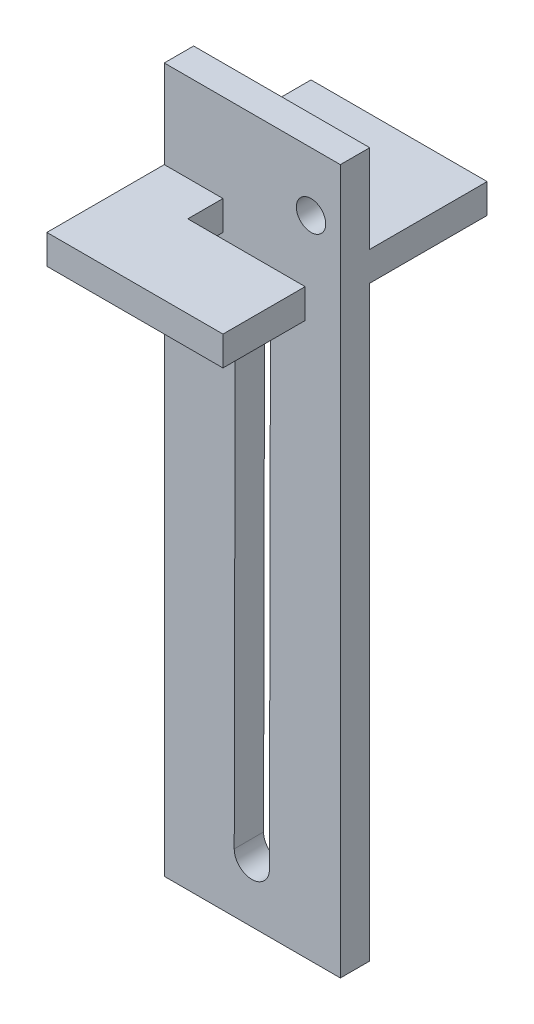
ISO-10303-21;
HEADER;
FILE_DESCRIPTION(('STEP AP214'),'2;1');
FILE_NAME('part.step','',(''),(''),'','','');
FILE_SCHEMA(('AUTOMOTIVE_DESIGN { 1 0 10303 214 1 1 1 1 }'));
ENDSEC;
DATA;
#1=APPLICATION_CONTEXT('core data for automotive mechanical design processes');
#2=APPLICATION_PROTOCOL_DEFINITION('international standard','automotive_design',2000,#1);
#3=PRODUCT_CONTEXT('',#1,'mechanical');
#4=PRODUCT('Part','Part','',(#3));
#5=PRODUCT_RELATED_PRODUCT_CATEGORY('part','',(#4));
#6=PRODUCT_DEFINITION_FORMATION('','',#4);
#7=PRODUCT_DEFINITION_CONTEXT('part definition',#1,'design');
#8=PRODUCT_DEFINITION('design','',#6,#7);
#9=PRODUCT_DEFINITION_SHAPE('','',#8);
#10=(LENGTH_UNIT() NAMED_UNIT(*) SI_UNIT(.MILLI.,.METRE.));
#11=(NAMED_UNIT(*) PLANE_ANGLE_UNIT() SI_UNIT($,.RADIAN.));
#12=(NAMED_UNIT(*) SI_UNIT($,.STERADIAN.) SOLID_ANGLE_UNIT());
#13=UNCERTAINTY_MEASURE_WITH_UNIT(LENGTH_MEASURE(1.E-05),#10,'distance_accuracy_value','');
#14=(GEOMETRIC_REPRESENTATION_CONTEXT(3) GLOBAL_UNCERTAINTY_ASSIGNED_CONTEXT((#13)) GLOBAL_UNIT_ASSIGNED_CONTEXT((#10,
#11,#12)) REPRESENTATION_CONTEXT('',''));
#15=CARTESIAN_POINT('',(0.,0.,0.));
#16=DIRECTION('',(0.,0.,1.));
#17=DIRECTION('',(1.,0.,0.));
#18=AXIS2_PLACEMENT_3D('',#15,#16,#17);
#19=CARTESIAN_POINT('',(26.5320893378885,41.3530947794546,5.));
#20=DIRECTION('',(-1.,0.,0.));
#21=DIRECTION('',(0.,-1.,0.));
#22=AXIS2_PLACEMENT_3D('',#19,#20,#21);
#23=PLANE('',#22);
#24=DIRECTION('',(0.,0.,-1.));
#25=VECTOR('',#24,1.);
#26=CARTESIAN_POINT('',(26.5320893378885,41.3530947794546,-20.));
#27=LINE('',#26,#25);
#28=CARTESIAN_POINT('',(26.5320893378885,41.3530947794546,25.));
#29=VERTEX_POINT('',#28);
#30=CARTESIAN_POINT('',(26.5320893378885,41.3530947794546,11.));
#31=VERTEX_POINT('',#30);
#32=EDGE_CURVE('E233',#29,#31,#27,.T.);
#33=ORIENTED_EDGE('',*,*,#32,.T.);
#34=DIRECTION('',(0.,-1.,0.));
#35=VECTOR('',#34,1.);
#36=CARTESIAN_POINT('',(26.5320893378885,46.3530947794546,11.));
#37=LINE('',#36,#35);
#38=CARTESIAN_POINT('',(26.5320893378885,46.3530947794546,11.));
#39=VERTEX_POINT('',#38);
#40=EDGE_CURVE('E165',#39,#31,#37,.T.);
#41=ORIENTED_EDGE('',*,*,#40,.F.);
#42=DIRECTION('',(0.,0.,-1.));
#43=VECTOR('',#42,1.);
#44=CARTESIAN_POINT('',(26.5320893378885,46.3530947794546,-20.));
#45=LINE('',#44,#43);
#46=CARTESIAN_POINT('',(26.5320893378885,46.3530947794546,25.));
#47=VERTEX_POINT('',#46);
#48=EDGE_CURVE('E221',#47,#39,#45,.T.);
#49=ORIENTED_EDGE('',*,*,#48,.F.);
#50=DIRECTION('',(0.,-1.,0.));
#51=VECTOR('',#50,1.);
#52=CARTESIAN_POINT('',(26.5320893378885,46.3530947794546,25.));
#53=LINE('',#52,#51);
#54=EDGE_CURVE('E242',#47,#29,#53,.T.);
#55=ORIENTED_EDGE('',*,*,#54,.T.);
#56=EDGE_LOOP('',(#33,#41,#49,#55));
#57=FACE_BOUND('',#56,.T.);
#58=ADVANCED_FACE('F33',(#57),#23,.F.);
#59=CARTESIAN_POINT('',(0.,46.3530947794546,0.));
#60=DIRECTION('',(0.,1.,0.));
#61=DIRECTION('',(0.,0.,1.));
#62=AXIS2_PLACEMENT_3D('',#59,#60,#61);
#63=PLANE('',#62);
#64=DIRECTION('',(-1.,0.,0.));
#65=VECTOR('',#64,1.);
#66=CARTESIAN_POINT('',(-3.46791066211148,46.3530947794546,0.));
#67=LINE('',#66,#65);
#68=CARTESIAN_POINT('',(26.5320893378885,46.3530947794546,0.));
#69=VERTEX_POINT('',#68);
#70=CARTESIAN_POINT('',(-3.46791066211148,46.3530947794546,0.));
#71=VERTEX_POINT('',#70);
#72=EDGE_CURVE('E49',#69,#71,#67,.T.);
#73=ORIENTED_EDGE('',*,*,#72,.F.);
#74=CARTESIAN_POINT('',(26.5320893378885,46.3530947794546,-20.));
#75=VERTEX_POINT('',#74);
#76=EDGE_CURVE('E220',#69,#75,#45,.T.);
#77=ORIENTED_EDGE('',*,*,#76,.T.);
#78=DIRECTION('',(-1.,0.,0.));
#79=VECTOR('',#78,1.);
#80=CARTESIAN_POINT('',(-3.46791066211148,46.3530947794546,-20.));
#81=LINE('',#80,#79);
#82=CARTESIAN_POINT('',(-3.46791066211148,46.3530947794546,-20.));
#83=VERTEX_POINT('',#82);
#84=EDGE_CURVE('E224',#75,#83,#81,.T.);
#85=ORIENTED_EDGE('',*,*,#84,.T.);
#86=DIRECTION('',(0.,0.,1.));
#87=VECTOR('',#86,1.);
#88=CARTESIAN_POINT('',(-3.46791066211148,46.3530947794546,-20.));
#89=LINE('',#88,#87);
#90=EDGE_CURVE('E215',#83,#71,#89,.T.);
#91=ORIENTED_EDGE('',*,*,#90,.T.);
#92=EDGE_LOOP('',(#73,#77,#85,#91));
#93=FACE_BOUND('',#92,.T.);
#94=ADVANCED_FACE('F346',(#93),#63,.T.);
#95=CARTESIAN_POINT('',(0.,0.,5.));
#96=DIRECTION('',(0.,0.,1.));
#97=DIRECTION('',(1.,0.,0.));
#98=AXIS2_PLACEMENT_3D('',#95,#96,#97);
#99=PLANE('',#98);
#100=DIRECTION('',(0.,-1.,0.));
#101=VECTOR('',#100,1.);
#102=CARTESIAN_POINT('',(-3.46791066211148,41.3530947794546,5.));
#103=LINE('',#102,#101);
#104=CARTESIAN_POINT('',(-3.46791066211148,41.3530947794546,5.));
#105=VERTEX_POINT('',#104);
#106=CARTESIAN_POINT('',(-3.46791066211147,-58.6469052205454,5.));
#107=VERTEX_POINT('',#106);
#108=EDGE_CURVE('E280',#105,#107,#103,.T.);
#109=ORIENTED_EDGE('',*,*,#108,.T.);
#110=DIRECTION('',(1.,0.,0.));
#111=VECTOR('',#110,1.);
#112=CARTESIAN_POINT('',(-3.46791066211147,-58.6469052205454,5.));
#113=LINE('',#112,#111);
#114=CARTESIAN_POINT('',(26.5320893378885,-58.6469052205454,5.));
#115=VERTEX_POINT('',#114);
#116=EDGE_CURVE('E283',#107,#115,#113,.T.);
#117=ORIENTED_EDGE('',*,*,#116,.T.);
#118=DIRECTION('',(0.,1.,0.));
#119=VECTOR('',#118,1.);
#120=CARTESIAN_POINT('',(26.5320893378885,41.3530947794546,5.));
#121=LINE('',#120,#119);
#122=CARTESIAN_POINT('',(26.5320893378885,61.3530947794546,5.));
#123=VERTEX_POINT('',#122);
#124=EDGE_CURVE('E286',#115,#123,#121,.T.);
#125=ORIENTED_EDGE('',*,*,#124,.T.);
#126=DIRECTION('',(1.,0.,0.));
#127=VECTOR('',#126,1.);
#128=CARTESIAN_POINT('',(-3.46791066211148,61.3530947794546,5.));
#129=LINE('',#128,#127);
#130=CARTESIAN_POINT('',(-3.46791066211148,61.3530947794546,5.));
#131=VERTEX_POINT('',#130);
#132=EDGE_CURVE('E196',#131,#123,#129,.T.);
#133=ORIENTED_EDGE('',*,*,#132,.F.);
#134=DIRECTION('',(0.,-1.,0.));
#135=VECTOR('',#134,1.);
#136=CARTESIAN_POINT('',(-3.46791066211148,61.3530947794546,5.));
#137=LINE('',#136,#135);
#138=CARTESIAN_POINT('',(-3.46791066211148,46.3530947794546,5.));
#139=VERTEX_POINT('',#138);
#140=EDGE_CURVE('E211',#131,#139,#137,.T.);
#141=ORIENTED_EDGE('',*,*,#140,.T.);
#142=DIRECTION('',(1.,0.,0.));
#143=VECTOR('',#142,1.);
#144=CARTESIAN_POINT('',(-3.46791066211148,46.3530947794546,5.));
#145=LINE('',#144,#143);
#146=CARTESIAN_POINT('',(6.53208933788852,46.3530947794546,5.));
#147=VERTEX_POINT('',#146);
#148=EDGE_CURVE('E57',#139,#147,#145,.T.);
#149=ORIENTED_EDGE('',*,*,#148,.T.);
#150=DIRECTION('',(0.,1.,0.));
#151=VECTOR('',#150,1.);
#152=CARTESIAN_POINT('',(6.53208933788852,46.3530947794546,5.));
#153=LINE('',#152,#151);
#154=CARTESIAN_POINT('',(6.53208933788852,41.3530947794546,5.));
#155=VERTEX_POINT('',#154);
#156=EDGE_CURVE('E183',#155,#147,#153,.T.);
#157=ORIENTED_EDGE('',*,*,#156,.F.);
#158=DIRECTION('',(-1.,0.,0.));
#159=VECTOR('',#158,1.);
#160=CARTESIAN_POINT('',(-3.46791066211148,41.3530947794546,5.));
#161=LINE('',#160,#159);
#162=EDGE_CURVE('E182',#155,#105,#161,.T.);
#163=ORIENTED_EDGE('',*,*,#162,.T.);
#164=EDGE_LOOP('',(#109,#117,#125,#133,#141,#149,#157,#163));
#165=FACE_BOUND('',#164,.T.);
#166=DIRECTION('',(-0.00209439357121925,-0.999997806755379,0.));
#167=VECTOR('',#166,1.);
#168=CARTESIAN_POINT('',(8.6158652644784,31.3593779739488,5.));
#169=LINE('',#168,#167);
#170=CARTESIAN_POINT('',(8.6158652644784,31.3593779739488,5.));
#171=VERTEX_POINT('',#170);
#172=CARTESIAN_POINT('',(8.44831341129867,-48.6406220260512,5.));
#173=VERTEX_POINT('',#172);
#174=EDGE_CURVE('E251',#171,#173,#169,.T.);
#175=ORIENTED_EDGE('',*,*,#174,.F.);
#176=CARTESIAN_POINT('',(11.6158652644784,31.3530947794546,5.));
#177=DIRECTION('',(0.,0.,1.));
#178=DIRECTION('',(1.,0.,0.));
#179=AXIS2_PLACEMENT_3D('',#176,#177,#178);
#180=CIRCLE('',#179,3.00000657974828);
#181=CARTESIAN_POINT('',(14.6158652644784,31.3468115849604,5.));
#182=VERTEX_POINT('',#181);
#183=EDGE_CURVE('E249',#182,#171,#180,.T.);
#184=ORIENTED_EDGE('',*,*,#183,.F.);
#185=DIRECTION('',(0.0020943935712189,0.999997806755379,0.));
#186=VECTOR('',#185,1.);
#187=CARTESIAN_POINT('',(14.6158652644784,31.3468115849604,5.));
#188=LINE('',#187,#186);
#189=CARTESIAN_POINT('',(14.4483134112987,-48.6531884150396,5.));
#190=VERTEX_POINT('',#189);
#191=EDGE_CURVE('E257',#190,#182,#188,.T.);
#192=ORIENTED_EDGE('',*,*,#191,.F.);
#193=CARTESIAN_POINT('',(11.4483134112987,-48.6469052205454,5.));
#194=DIRECTION('',(0.,0.,1.));
#195=DIRECTION('',(1.,0.,0.));
#196=AXIS2_PLACEMENT_3D('',#193,#194,#195);
#197=CIRCLE('',#196,3.0000065797483);
#198=EDGE_CURVE('E254',#173,#190,#197,.T.);
#199=ORIENTED_EDGE('',*,*,#198,.F.);
#200=EDGE_LOOP('',(#175,#184,#192,#199));
#201=FACE_BOUND('',#200,.T.);
#202=CARTESIAN_POINT('',(21.5320893378885,51.3530947794546,5.));
#203=DIRECTION('',(0.,0.,1.));
#204=DIRECTION('',(1.,0.,0.));
#205=AXIS2_PLACEMENT_3D('',#202,#203,#204);
#206=CIRCLE('',#205,2.5);
#207=CARTESIAN_POINT('',(24.0320893378885,51.3530947794546,5.));
#208=VERTEX_POINT('',#207);
#209=EDGE_CURVE('E189',#208,#208,#206,.T.);
#210=ORIENTED_EDGE('',*,*,#209,.F.);
#211=EDGE_LOOP('',(#210));
#212=FACE_BOUND('',#211,.T.);
#213=ADVANCED_FACE('F332',(#165,#201,#212),#99,.T.);
#214=CARTESIAN_POINT('',(0.,0.,0.));
#215=DIRECTION('',(0.,0.,1.));
#216=DIRECTION('',(1.,0.,0.));
#217=AXIS2_PLACEMENT_3D('',#214,#215,#216);
#218=PLANE('',#217);
#219=DIRECTION('',(0.,-1.,0.));
#220=VECTOR('',#219,1.);
#221=CARTESIAN_POINT('',(-3.46791066211148,41.3530947794546,0.));
#222=LINE('',#221,#220);
#223=CARTESIAN_POINT('',(-3.46791066211148,41.3530947794546,0.));
#224=VERTEX_POINT('',#223);
#225=CARTESIAN_POINT('',(-3.46791066211147,-58.6469052205454,0.));
#226=VERTEX_POINT('',#225);
#227=EDGE_CURVE('E279',#224,#226,#222,.T.);
#228=ORIENTED_EDGE('',*,*,#227,.F.);
#229=DIRECTION('',(-1.,0.,0.));
#230=VECTOR('',#229,1.);
#231=CARTESIAN_POINT('',(-3.46791066211148,41.3530947794546,0.));
#232=LINE('',#231,#230);
#233=CARTESIAN_POINT('',(26.5320893378885,41.3530947794546,0.));
#234=VERTEX_POINT('',#233);
#235=EDGE_CURVE('E284',#234,#224,#232,.T.);
#236=ORIENTED_EDGE('',*,*,#235,.F.);
#237=DIRECTION('',(0.,1.,0.));
#238=VECTOR('',#237,1.);
#239=CARTESIAN_POINT('',(26.5320893378885,41.3530947794546,0.));
#240=LINE('',#239,#238);
#241=CARTESIAN_POINT('',(26.5320893378885,-58.6469052205454,0.));
#242=VERTEX_POINT('',#241);
#243=EDGE_CURVE('E293',#242,#234,#240,.T.);
#244=ORIENTED_EDGE('',*,*,#243,.F.);
#245=DIRECTION('',(1.,0.,0.));
#246=VECTOR('',#245,1.);
#247=CARTESIAN_POINT('',(-3.46791066211147,-58.6469052205454,0.));
#248=LINE('',#247,#246);
#249=EDGE_CURVE('E291',#226,#242,#248,.T.);
#250=ORIENTED_EDGE('',*,*,#249,.F.);
#251=EDGE_LOOP('',(#228,#236,#244,#250));
#252=FACE_BOUND('',#251,.T.);
#253=CARTESIAN_POINT('',(11.6158652644784,31.3530947794546,0.));
#254=DIRECTION('',(0.,0.,1.));
#255=DIRECTION('',(1.,0.,0.));
#256=AXIS2_PLACEMENT_3D('',#253,#254,#255);
#257=CIRCLE('',#256,3.00000657974828);
#258=CARTESIAN_POINT('',(14.6158652644784,31.3468115849604,0.));
#259=VERTEX_POINT('',#258);
#260=CARTESIAN_POINT('',(8.6158652644784,31.3593779739488,0.));
#261=VERTEX_POINT('',#260);
#262=EDGE_CURVE('E248',#259,#261,#257,.T.);
#263=ORIENTED_EDGE('',*,*,#262,.T.);
#264=DIRECTION('',(-0.00209439357121925,-0.999997806755379,0.));
#265=VECTOR('',#264,1.);
#266=CARTESIAN_POINT('',(8.6158652644784,31.3593779739488,0.));
#267=LINE('',#266,#265);
#268=CARTESIAN_POINT('',(8.44831341129867,-48.6406220260512,0.));
#269=VERTEX_POINT('',#268);
#270=EDGE_CURVE('E262',#261,#269,#267,.T.);
#271=ORIENTED_EDGE('',*,*,#270,.T.);
#272=CARTESIAN_POINT('',(11.4483134112987,-48.6469052205454,0.));
#273=DIRECTION('',(0.,0.,1.));
#274=DIRECTION('',(1.,0.,0.));
#275=AXIS2_PLACEMENT_3D('',#272,#273,#274);
#276=CIRCLE('',#275,3.0000065797483);
#277=CARTESIAN_POINT('',(14.4483134112987,-48.6531884150396,0.));
#278=VERTEX_POINT('',#277);
#279=EDGE_CURVE('E265',#269,#278,#276,.T.);
#280=ORIENTED_EDGE('',*,*,#279,.T.);
#281=DIRECTION('',(0.0020943935712189,0.999997806755379,0.));
#282=VECTOR('',#281,1.);
#283=CARTESIAN_POINT('',(14.6158652644784,31.3468115849604,0.));
#284=LINE('',#283,#282);
#285=EDGE_CURVE('E252',#278,#259,#284,.T.);
#286=ORIENTED_EDGE('',*,*,#285,.T.);
#287=EDGE_LOOP('',(#263,#271,#280,#286));
#288=FACE_BOUND('',#287,.T.);
#289=ADVANCED_FACE('F308',(#252,#288),#218,.F.);
#290=CARTESIAN_POINT('',(-3.46791066211148,41.3530947794546,5.));
#291=DIRECTION('',(1.,0.,0.));
#292=DIRECTION('',(0.,1.,0.));
#293=AXIS2_PLACEMENT_3D('',#290,#291,#292);
#294=PLANE('',#293);
#295=ORIENTED_EDGE('',*,*,#227,.T.);
#296=DIRECTION('',(0.,0.,-1.));
#297=VECTOR('',#296,1.);
#298=CARTESIAN_POINT('',(-3.46791066211147,-58.6469052205454,5.));
#299=LINE('',#298,#297);
#300=EDGE_CURVE('E11',#107,#226,#299,.T.);
#301=ORIENTED_EDGE('',*,*,#300,.F.);
#302=ORIENTED_EDGE('',*,*,#108,.F.);
#303=DIRECTION('',(0.,0.,1.));
#304=VECTOR('',#303,1.);
#305=CARTESIAN_POINT('',(-3.46791066211148,41.3530947794546,-20.));
#306=LINE('',#305,#304);
#307=CARTESIAN_POINT('',(-3.46791066211148,41.3530947794546,25.));
#308=VERTEX_POINT('',#307);
#309=EDGE_CURVE('E214',#105,#308,#306,.T.);
#310=ORIENTED_EDGE('',*,*,#309,.T.);
#311=DIRECTION('',(0.,-1.,0.));
#312=VECTOR('',#311,1.);
#313=CARTESIAN_POINT('',(-3.46791066211148,46.3530947794546,25.));
#314=LINE('',#313,#312);
#315=CARTESIAN_POINT('',(-3.46791066211148,46.3530947794546,25.));
#316=VERTEX_POINT('',#315);
#317=EDGE_CURVE('E245',#316,#308,#314,.T.);
#318=ORIENTED_EDGE('',*,*,#317,.F.);
#319=EDGE_CURVE('E218',#139,#316,#89,.T.);
#320=ORIENTED_EDGE('',*,*,#319,.F.);
#321=ORIENTED_EDGE('',*,*,#140,.F.);
#322=DIRECTION('',(0.,0.,1.));
#323=VECTOR('',#322,1.);
#324=CARTESIAN_POINT('',(-3.46791066211148,61.3530947794546,0.));
#325=LINE('',#324,#323);
#326=CARTESIAN_POINT('',(-3.46791066211148,61.3530947794546,0.));
#327=VERTEX_POINT('',#326);
#328=EDGE_CURVE('E193',#327,#131,#325,.T.);
#329=ORIENTED_EDGE('',*,*,#328,.F.);
#330=DIRECTION('',(0.,-1.,0.));
#331=VECTOR('',#330,1.);
#332=CARTESIAN_POINT('',(-3.46791066211148,61.3530947794546,0.));
#333=LINE('',#332,#331);
#334=EDGE_CURVE('E203',#327,#71,#333,.T.);
#335=ORIENTED_EDGE('',*,*,#334,.T.);
#336=ORIENTED_EDGE('',*,*,#90,.F.);
#337=DIRECTION('',(0.,-1.,0.));
#338=VECTOR('',#337,1.);
#339=CARTESIAN_POINT('',(-3.46791066211148,46.3530947794546,-20.));
#340=LINE('',#339,#338);
#341=CARTESIAN_POINT('',(-3.46791066211148,41.3530947794546,-20.));
#342=VERTEX_POINT('',#341);
#343=EDGE_CURVE('E226',#83,#342,#340,.T.);
#344=ORIENTED_EDGE('',*,*,#343,.T.);
#345=EDGE_CURVE('E227',#342,#224,#306,.T.);
#346=ORIENTED_EDGE('',*,*,#345,.T.);
#347=EDGE_LOOP('',(#295,#301,#302,#310,#318,#320,#321,#329,#335,#336,#344,#346));
#348=FACE_BOUND('',#347,.T.);
#349=ADVANCED_FACE('F35',(#348),#294,.F.);
#350=CARTESIAN_POINT('',(-3.46791066211147,-58.6469052205454,5.));
#351=DIRECTION('',(0.,1.,0.));
#352=DIRECTION('',(0.,0.,1.));
#353=AXIS2_PLACEMENT_3D('',#350,#351,#352);
#354=PLANE('',#353);
#355=ORIENTED_EDGE('',*,*,#249,.T.);
#356=DIRECTION('',(0.,0.,-1.));
#357=VECTOR('',#356,1.);
#358=CARTESIAN_POINT('',(26.5320893378885,-58.6469052205454,5.));
#359=LINE('',#358,#357);
#360=EDGE_CURVE('E42',#115,#242,#359,.T.);
#361=ORIENTED_EDGE('',*,*,#360,.F.);
#362=ORIENTED_EDGE('',*,*,#116,.F.);
#363=ORIENTED_EDGE('',*,*,#300,.T.);
#364=EDGE_LOOP('',(#355,#361,#362,#363));
#365=FACE_BOUND('',#364,.T.);
#366=ADVANCED_FACE('F335',(#365),#354,.F.);
#367=DIRECTION('',(0.,0.,-1.));
#368=VECTOR('',#367,1.);
#369=CARTESIAN_POINT('',(26.5320893378885,61.3530947794546,0.));
#370=LINE('',#369,#368);
#371=CARTESIAN_POINT('',(26.5320893378885,61.3530947794546,0.));
#372=VERTEX_POINT('',#371);
#373=EDGE_CURVE('E199',#123,#372,#370,.T.);
#374=ORIENTED_EDGE('',*,*,#373,.F.);
#375=ORIENTED_EDGE('',*,*,#124,.F.);
#376=ORIENTED_EDGE('',*,*,#360,.T.);
#377=ORIENTED_EDGE('',*,*,#243,.T.);
#378=CARTESIAN_POINT('',(26.5320893378885,41.3530947794546,-20.));
#379=VERTEX_POINT('',#378);
#380=EDGE_CURVE('E232',#234,#379,#27,.T.);
#381=ORIENTED_EDGE('',*,*,#380,.T.);
#382=DIRECTION('',(0.,-1.,0.));
#383=VECTOR('',#382,1.);
#384=CARTESIAN_POINT('',(26.5320893378885,46.3530947794546,-20.));
#385=LINE('',#384,#383);
#386=EDGE_CURVE('E239',#75,#379,#385,.T.);
#387=ORIENTED_EDGE('',*,*,#386,.F.);
#388=ORIENTED_EDGE('',*,*,#76,.F.);
#389=DIRECTION('',(0.,-1.,0.));
#390=VECTOR('',#389,1.);
#391=CARTESIAN_POINT('',(26.5320893378885,61.3530947794546,0.));
#392=LINE('',#391,#390);
#393=EDGE_CURVE('E208',#372,#69,#392,.T.);
#394=ORIENTED_EDGE('',*,*,#393,.F.);
#395=EDGE_LOOP('',(#374,#375,#376,#377,#381,#387,#388,#394));
#396=FACE_BOUND('',#395,.T.);
#397=ADVANCED_FACE('F303',(#396),#23,.F.);
#398=CARTESIAN_POINT('',(11.6158652644784,31.3530947794546,5.));
#399=DIRECTION('',(0.,0.,-1.));
#400=DIRECTION('',(-1.,0.,0.));
#401=AXIS2_PLACEMENT_3D('',#398,#399,#400);
#402=CYLINDRICAL_SURFACE('',#401,3.00000657974828);
#403=ORIENTED_EDGE('',*,*,#262,.F.);
#404=DIRECTION('',(0.,0.,-1.));
#405=VECTOR('',#404,1.);
#406=CARTESIAN_POINT('',(14.6158652644784,31.3468115849604,5.));
#407=LINE('',#406,#405);
#408=EDGE_CURVE('E259',#182,#259,#407,.T.);
#409=ORIENTED_EDGE('',*,*,#408,.F.);
#410=ORIENTED_EDGE('',*,*,#183,.T.);
#411=DIRECTION('',(0.,0.,-1.));
#412=VECTOR('',#411,1.);
#413=CARTESIAN_POINT('',(8.6158652644784,31.3593779739488,5.));
#414=LINE('',#413,#412);
#415=EDGE_CURVE('E276',#171,#261,#414,.T.);
#416=ORIENTED_EDGE('',*,*,#415,.T.);
#417=EDGE_LOOP('',(#403,#409,#410,#416));
#418=FACE_BOUND('',#417,.T.);
#419=ADVANCED_FACE('F354',(#418),#402,.F.);
#420=CARTESIAN_POINT('',(8.6158652644784,31.3593779739488,5.));
#421=DIRECTION('',(0.999997806755379,-0.00209439357121925,0.));
#422=DIRECTION('',(0.00209439357121925,0.999997806755379,0.));
#423=AXIS2_PLACEMENT_3D('',#420,#421,#422);
#424=PLANE('',#423);
#425=ORIENTED_EDGE('',*,*,#270,.F.);
#426=ORIENTED_EDGE('',*,*,#415,.F.);
#427=ORIENTED_EDGE('',*,*,#174,.T.);
#428=DIRECTION('',(0.,0.,-1.));
#429=VECTOR('',#428,1.);
#430=CARTESIAN_POINT('',(8.44831341129867,-48.6406220260512,5.));
#431=LINE('',#430,#429);
#432=EDGE_CURVE('E274',#173,#269,#431,.T.);
#433=ORIENTED_EDGE('',*,*,#432,.T.);
#434=EDGE_LOOP('',(#425,#426,#427,#433));
#435=FACE_BOUND('',#434,.T.);
#436=ADVANCED_FACE('F359',(#435),#424,.T.);
#437=CARTESIAN_POINT('',(11.4483134112987,-48.6469052205454,5.));
#438=DIRECTION('',(0.,0.,-1.));
#439=DIRECTION('',(-1.,0.,0.));
#440=AXIS2_PLACEMENT_3D('',#437,#438,#439);
#441=CYLINDRICAL_SURFACE('',#440,3.0000065797483);
#442=ORIENTED_EDGE('',*,*,#279,.F.);
#443=ORIENTED_EDGE('',*,*,#432,.F.);
#444=ORIENTED_EDGE('',*,*,#198,.T.);
#445=DIRECTION('',(0.,0.,-1.));
#446=VECTOR('',#445,1.);
#447=CARTESIAN_POINT('',(14.4483134112987,-48.6531884150396,5.));
#448=LINE('',#447,#446);
#449=EDGE_CURVE('E272',#190,#278,#448,.T.);
#450=ORIENTED_EDGE('',*,*,#449,.T.);
#451=EDGE_LOOP('',(#442,#443,#444,#450));
#452=FACE_BOUND('',#451,.T.);
#453=ADVANCED_FACE('F375',(#452),#441,.F.);
#454=CARTESIAN_POINT('',(14.6158652644784,31.3468115849604,5.));
#455=DIRECTION('',(-0.999997806755379,0.0020943935712189,0.));
#456=DIRECTION('',(-0.0020943935712189,-0.999997806755379,0.));
#457=AXIS2_PLACEMENT_3D('',#454,#455,#456);
#458=PLANE('',#457);
#459=ORIENTED_EDGE('',*,*,#285,.F.);
#460=ORIENTED_EDGE('',*,*,#449,.F.);
#461=ORIENTED_EDGE('',*,*,#191,.T.);
#462=ORIENTED_EDGE('',*,*,#408,.T.);
#463=EDGE_LOOP('',(#459,#460,#461,#462));
#464=FACE_BOUND('',#463,.T.);
#465=ADVANCED_FACE('F379',(#464),#458,.T.);
#466=CARTESIAN_POINT('',(0.,41.3530947794546,0.));
#467=DIRECTION('',(0.,1.,0.));
#468=DIRECTION('',(0.,0.,1.));
#469=AXIS2_PLACEMENT_3D('',#466,#467,#468);
#470=PLANE('',#469);
#471=ORIENTED_EDGE('',*,*,#380,.F.);
#472=ORIENTED_EDGE('',*,*,#235,.T.);
#473=ORIENTED_EDGE('',*,*,#345,.F.);
#474=DIRECTION('',(-1.,0.,0.));
#475=VECTOR('',#474,1.);
#476=CARTESIAN_POINT('',(-3.46791066211148,41.3530947794546,-20.));
#477=LINE('',#476,#475);
#478=EDGE_CURVE('E235',#379,#342,#477,.T.);
#479=ORIENTED_EDGE('',*,*,#478,.F.);
#480=EDGE_LOOP('',(#471,#472,#473,#479));
#481=FACE_BOUND('',#480,.T.);
#482=ADVANCED_FACE('F312',(#481),#470,.F.);
#483=CARTESIAN_POINT('',(-3.46791066211148,46.3530947794546,25.));
#484=DIRECTION('',(0.,0.,-1.));
#485=DIRECTION('',(-1.,0.,0.));
#486=AXIS2_PLACEMENT_3D('',#483,#484,#485);
#487=PLANE('',#486);
#488=DIRECTION('',(1.,0.,0.));
#489=VECTOR('',#488,1.);
#490=CARTESIAN_POINT('',(-3.46791066211148,41.3530947794546,25.));
#491=LINE('',#490,#489);
#492=EDGE_CURVE('E230',#308,#29,#491,.T.);
#493=ORIENTED_EDGE('',*,*,#492,.T.);
#494=ORIENTED_EDGE('',*,*,#54,.F.);
#495=DIRECTION('',(1.,0.,0.));
#496=VECTOR('',#495,1.);
#497=CARTESIAN_POINT('',(-3.46791066211148,46.3530947794546,25.));
#498=LINE('',#497,#496);
#499=EDGE_CURVE('E217',#316,#47,#498,.T.);
#500=ORIENTED_EDGE('',*,*,#499,.F.);
#501=ORIENTED_EDGE('',*,*,#317,.T.);
#502=EDGE_LOOP('',(#493,#494,#500,#501));
#503=FACE_BOUND('',#502,.T.);
#504=ADVANCED_FACE('F341',(#503),#487,.F.);
#505=CARTESIAN_POINT('',(-3.46791066211148,46.3530947794546,-20.));
#506=DIRECTION('',(0.,0.,1.));
#507=DIRECTION('',(1.,0.,0.));
#508=AXIS2_PLACEMENT_3D('',#505,#506,#507);
#509=PLANE('',#508);
#510=ORIENTED_EDGE('',*,*,#478,.T.);
#511=ORIENTED_EDGE('',*,*,#343,.F.);
#512=ORIENTED_EDGE('',*,*,#84,.F.);
#513=ORIENTED_EDGE('',*,*,#386,.T.);
#514=EDGE_LOOP('',(#510,#511,#512,#513));
#515=FACE_BOUND('',#514,.T.);
#516=ADVANCED_FACE('F320',(#515),#509,.F.);
#517=DIRECTION('',(1.,0.,0.));
#518=VECTOR('',#517,1.);
#519=CARTESIAN_POINT('',(6.53208933788852,46.3530947794546,11.));
#520=LINE('',#519,#518);
#521=CARTESIAN_POINT('',(6.53208933788852,46.3530947794546,11.));
#522=VERTEX_POINT('',#521);
#523=EDGE_CURVE('E170',#522,#39,#520,.T.);
#524=ORIENTED_EDGE('',*,*,#523,.F.);
#525=DIRECTION('',(0.,0.,1.));
#526=VECTOR('',#525,1.);
#527=CARTESIAN_POINT('',(6.53208933788852,46.3530947794546,11.));
#528=LINE('',#527,#526);
#529=EDGE_CURVE('E171',#147,#522,#528,.T.);
#530=ORIENTED_EDGE('',*,*,#529,.F.);
#531=ORIENTED_EDGE('',*,*,#148,.F.);
#532=ORIENTED_EDGE('',*,*,#319,.T.);
#533=ORIENTED_EDGE('',*,*,#499,.T.);
#534=ORIENTED_EDGE('',*,*,#48,.T.);
#535=EDGE_LOOP('',(#524,#530,#531,#532,#533,#534));
#536=FACE_BOUND('',#535,.T.);
#537=ADVANCED_FACE('F343',(#536),#63,.T.);
#538=DIRECTION('',(0.,0.,-1.));
#539=VECTOR('',#538,1.);
#540=CARTESIAN_POINT('',(6.53208933788852,41.3530947794546,11.));
#541=LINE('',#540,#539);
#542=CARTESIAN_POINT('',(6.53208933788852,41.3530947794546,11.));
#543=VERTEX_POINT('',#542);
#544=EDGE_CURVE('E176',#543,#155,#541,.T.);
#545=ORIENTED_EDGE('',*,*,#544,.F.);
#546=DIRECTION('',(1.,0.,0.));
#547=VECTOR('',#546,1.);
#548=CARTESIAN_POINT('',(6.53208933788852,41.3530947794546,11.));
#549=LINE('',#548,#547);
#550=EDGE_CURVE('E159',#543,#31,#549,.T.);
#551=ORIENTED_EDGE('',*,*,#550,.T.);
#552=ORIENTED_EDGE('',*,*,#32,.F.);
#553=ORIENTED_EDGE('',*,*,#492,.F.);
#554=ORIENTED_EDGE('',*,*,#309,.F.);
#555=ORIENTED_EDGE('',*,*,#162,.F.);
#556=EDGE_LOOP('',(#545,#551,#552,#553,#554,#555));
#557=FACE_BOUND('',#556,.T.);
#558=ADVANCED_FACE('F180',(#557),#470,.F.);
#559=CARTESIAN_POINT('',(-3.46791066211148,61.3530947794546,0.));
#560=DIRECTION('',(0.,0.,1.));
#561=DIRECTION('',(1.,0.,0.));
#562=AXIS2_PLACEMENT_3D('',#559,#560,#561);
#563=PLANE('',#562);
#564=CARTESIAN_POINT('',(21.5320893378885,51.3530947794546,0.));
#565=DIRECTION('',(0.,0.,1.));
#566=DIRECTION('',(1.,0.,0.));
#567=AXIS2_PLACEMENT_3D('',#564,#565,#566);
#568=CIRCLE('',#567,2.5);
#569=CARTESIAN_POINT('',(24.0320893378885,51.3530947794546,0.));
#570=VERTEX_POINT('',#569);
#571=EDGE_CURVE('E37',#570,#570,#568,.T.);
#572=ORIENTED_EDGE('',*,*,#571,.T.);
#573=EDGE_LOOP('',(#572));
#574=FACE_BOUND('',#573,.T.);
#575=ORIENTED_EDGE('',*,*,#72,.T.);
#576=ORIENTED_EDGE('',*,*,#334,.F.);
#577=DIRECTION('',(-1.,0.,0.));
#578=VECTOR('',#577,1.);
#579=CARTESIAN_POINT('',(-3.46791066211148,61.3530947794546,0.));
#580=LINE('',#579,#578);
#581=EDGE_CURVE('E201',#372,#327,#580,.T.);
#582=ORIENTED_EDGE('',*,*,#581,.F.);
#583=ORIENTED_EDGE('',*,*,#393,.T.);
#584=EDGE_LOOP('',(#575,#576,#582,#583));
#585=FACE_BOUND('',#584,.T.);
#586=ADVANCED_FACE('F325',(#574,#585),#563,.F.);
#587=CARTESIAN_POINT('',(0.,61.3530947794546,0.));
#588=DIRECTION('',(0.,1.,0.));
#589=DIRECTION('',(0.,0.,1.));
#590=AXIS2_PLACEMENT_3D('',#587,#588,#589);
#591=PLANE('',#590);
#592=ORIENTED_EDGE('',*,*,#328,.T.);
#593=ORIENTED_EDGE('',*,*,#132,.T.);
#594=ORIENTED_EDGE('',*,*,#373,.T.);
#595=ORIENTED_EDGE('',*,*,#581,.T.);
#596=EDGE_LOOP('',(#592,#593,#594,#595));
#597=FACE_BOUND('',#596,.T.);
#598=ADVANCED_FACE('F329',(#597),#591,.T.);
#599=CARTESIAN_POINT('',(21.5320893378885,51.3530947794546,-2.99999999999999));
#600=DIRECTION('',(0.,0.,1.));
#601=DIRECTION('',(1.,0.,0.));
#602=AXIS2_PLACEMENT_3D('',#599,#600,#601);
#603=CYLINDRICAL_SURFACE('',#602,2.5);
#604=ORIENTED_EDGE('',*,*,#209,.T.);
#605=EDGE_LOOP('',(#604));
#606=FACE_BOUND('',#605,.T.);
#607=ORIENTED_EDGE('',*,*,#571,.F.);
#608=EDGE_LOOP('',(#607));
#609=FACE_BOUND('',#608,.T.);
#610=ADVANCED_FACE('F396',(#606,#609),#603,.F.);
#611=CARTESIAN_POINT('',(6.53208933788852,46.3530947794546,11.));
#612=DIRECTION('',(0.,0.,1.));
#613=DIRECTION('',(1.,0.,0.));
#614=AXIS2_PLACEMENT_3D('',#611,#612,#613);
#615=PLANE('',#614);
#616=ORIENTED_EDGE('',*,*,#40,.T.);
#617=ORIENTED_EDGE('',*,*,#550,.F.);
#618=DIRECTION('',(0.,-1.,0.));
#619=VECTOR('',#618,1.);
#620=CARTESIAN_POINT('',(6.53208933788852,46.3530947794546,11.));
#621=LINE('',#620,#619);
#622=EDGE_CURVE('E162',#522,#543,#621,.T.);
#623=ORIENTED_EDGE('',*,*,#622,.F.);
#624=ORIENTED_EDGE('',*,*,#523,.T.);
#625=EDGE_LOOP('',(#616,#617,#623,#624));
#626=FACE_BOUND('',#625,.T.);
#627=ADVANCED_FACE('F161',(#626),#615,.F.);
#628=CARTESIAN_POINT('',(6.53208933788852,0.,0.));
#629=DIRECTION('',(1.,0.,0.));
#630=DIRECTION('',(0.,0.,-1.));
#631=AXIS2_PLACEMENT_3D('',#628,#629,#630);
#632=PLANE('',#631);
#633=ORIENTED_EDGE('',*,*,#622,.T.);
#634=ORIENTED_EDGE('',*,*,#544,.T.);
#635=ORIENTED_EDGE('',*,*,#156,.T.);
#636=ORIENTED_EDGE('',*,*,#529,.T.);
#637=EDGE_LOOP('',(#633,#634,#635,#636));
#638=FACE_BOUND('',#637,.T.);
#639=ADVANCED_FACE('F175',(#638),#632,.T.);
#640=CLOSED_SHELL('',(#58,#94,#213,#289,#349,#366,#397,#419,#436,#453,#465,#482,#504,#516,#537,
#558,#586,#598,#610,#627,#639));
#641=MANIFOLD_SOLID_BREP('B2',#640);
#642=ADVANCED_BREP_SHAPE_REPRESENTATION('',(#18,#641),#14);
#643=SHAPE_DEFINITION_REPRESENTATION(#9,#642);
ENDSEC;
END-ISO-10303-21;
